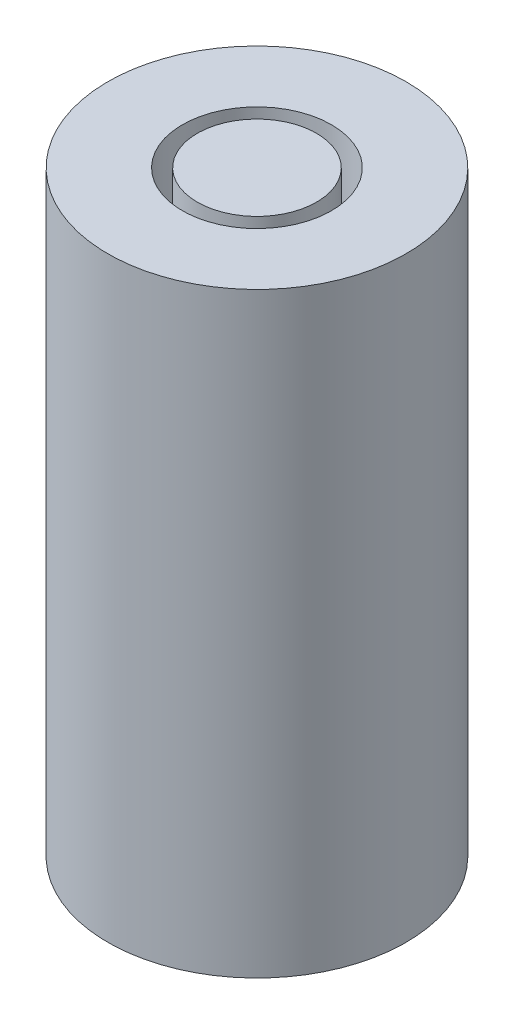
ISO-10303-21;
HEADER;
FILE_DESCRIPTION(('STEP AP214'),'2;1');
FILE_NAME('part.step','',(''),(''),'','','');
FILE_SCHEMA(('AUTOMOTIVE_DESIGN { 1 0 10303 214 1 1 1 1 }'));
ENDSEC;
DATA;
#1=APPLICATION_CONTEXT('core data for automotive mechanical design processes');
#2=APPLICATION_PROTOCOL_DEFINITION('international standard','automotive_design',2000,#1);
#3=PRODUCT_CONTEXT('',#1,'mechanical');
#4=PRODUCT('Part','Part','',(#3));
#5=PRODUCT_RELATED_PRODUCT_CATEGORY('part','',(#4));
#6=PRODUCT_DEFINITION_FORMATION('','',#4);
#7=PRODUCT_DEFINITION_CONTEXT('part definition',#1,'design');
#8=PRODUCT_DEFINITION('design','',#6,#7);
#9=PRODUCT_DEFINITION_SHAPE('','',#8);
#10=(LENGTH_UNIT() NAMED_UNIT(*) SI_UNIT(.MILLI.,.METRE.));
#11=(NAMED_UNIT(*) PLANE_ANGLE_UNIT() SI_UNIT($,.RADIAN.));
#12=(NAMED_UNIT(*) SI_UNIT($,.STERADIAN.) SOLID_ANGLE_UNIT());
#13=UNCERTAINTY_MEASURE_WITH_UNIT(LENGTH_MEASURE(1.E-05),#10,'distance_accuracy_value','');
#14=(GEOMETRIC_REPRESENTATION_CONTEXT(3) GLOBAL_UNCERTAINTY_ASSIGNED_CONTEXT((#13)) GLOBAL_UNIT_ASSIGNED_CONTEXT((#10,
#11,#12)) REPRESENTATION_CONTEXT('',''));
#15=CARTESIAN_POINT('',(0.,0.,0.));
#16=DIRECTION('',(0.,0.,1.));
#17=DIRECTION('',(1.,0.,0.));
#18=AXIS2_PLACEMENT_3D('',#15,#16,#17);
#19=CARTESIAN_POINT('',(0.,10.,0.));
#20=DIRECTION('',(0.,-1.,0.));
#21=DIRECTION('',(0.,0.,-1.));
#22=AXIS2_PLACEMENT_3D('',#19,#20,#21);
#23=CYLINDRICAL_SURFACE('',#22,2.5);
#24=CARTESIAN_POINT('',(0.,10.,0.));
#25=DIRECTION('',(0.,-1.,0.));
#26=DIRECTION('',(0.,0.,-1.));
#27=AXIS2_PLACEMENT_3D('',#24,#25,#26);
#28=CIRCLE('',#27,2.5);
#29=CARTESIAN_POINT('',(0.,10.,-2.5));
#30=VERTEX_POINT('',#29);
#31=EDGE_CURVE('E11',#30,#30,#28,.T.);
#32=ORIENTED_EDGE('',*,*,#31,.T.);
#33=EDGE_LOOP('',(#32));
#34=FACE_BOUND('',#33,.T.);
#35=CARTESIAN_POINT('',(0.,0.,0.));
#36=DIRECTION('',(0.,-1.,0.));
#37=DIRECTION('',(0.,0.,-1.));
#38=AXIS2_PLACEMENT_3D('',#35,#36,#37);
#39=CIRCLE('',#38,2.5);
#40=CARTESIAN_POINT('',(0.,0.,-2.5));
#41=VERTEX_POINT('',#40);
#42=EDGE_CURVE('E46',#41,#41,#39,.T.);
#43=ORIENTED_EDGE('',*,*,#42,.F.);
#44=EDGE_LOOP('',(#43));
#45=FACE_BOUND('',#44,.T.);
#46=ADVANCED_FACE('F43',(#34,#45),#23,.T.);
#47=CARTESIAN_POINT('',(0.,10.,0.));
#48=DIRECTION('',(0.,-1.,0.));
#49=DIRECTION('',(0.,0.,-1.));
#50=AXIS2_PLACEMENT_3D('',#47,#48,#49);
#51=PLANE('',#50);
#52=CARTESIAN_POINT('',(0.,10.,0.));
#53=DIRECTION('',(0.,-1.,0.));
#54=DIRECTION('',(0.,0.,-1.));
#55=AXIS2_PLACEMENT_3D('',#52,#53,#54);
#56=CIRCLE('',#55,1.25);
#57=CARTESIAN_POINT('',(0.,10.,-1.25));
#58=VERTEX_POINT('',#57);
#59=EDGE_CURVE('E53',#58,#58,#56,.T.);
#60=ORIENTED_EDGE('',*,*,#59,.T.);
#61=EDGE_LOOP('',(#60));
#62=FACE_BOUND('',#61,.T.);
#63=ORIENTED_EDGE('',*,*,#31,.F.);
#64=EDGE_LOOP('',(#63));
#65=FACE_BOUND('',#64,.T.);
#66=ADVANCED_FACE('F61',(#62,#65),#51,.F.);
#67=CARTESIAN_POINT('',(0.,0.,0.));
#68=DIRECTION('',(0.,-1.,0.));
#69=DIRECTION('',(0.,0.,-1.));
#70=AXIS2_PLACEMENT_3D('',#67,#68,#69);
#71=PLANE('',#70);
#72=CARTESIAN_POINT('',(0.,0.,0.));
#73=DIRECTION('',(0.,-1.,0.));
#74=DIRECTION('',(0.,0.,-1.));
#75=AXIS2_PLACEMENT_3D('',#72,#73,#74);
#76=CIRCLE('',#75,1.25);
#77=CARTESIAN_POINT('',(0.,0.,-1.25));
#78=VERTEX_POINT('',#77);
#79=EDGE_CURVE('E55',#78,#78,#76,.T.);
#80=ORIENTED_EDGE('',*,*,#79,.F.);
#81=EDGE_LOOP('',(#80));
#82=FACE_BOUND('',#81,.T.);
#83=ORIENTED_EDGE('',*,*,#42,.T.);
#84=EDGE_LOOP('',(#83));
#85=FACE_BOUND('',#84,.T.);
#86=ADVANCED_FACE('F67',(#82,#85),#71,.T.);
#87=CARTESIAN_POINT('',(0.,10.,0.));
#88=DIRECTION('',(0.,-1.,0.));
#89=DIRECTION('',(0.,0.,-1.));
#90=AXIS2_PLACEMENT_3D('',#87,#88,#89);
#91=CYLINDRICAL_SURFACE('',#90,1.25);
#92=ORIENTED_EDGE('',*,*,#59,.F.);
#93=EDGE_LOOP('',(#92));
#94=FACE_BOUND('',#93,.T.);
#95=ORIENTED_EDGE('',*,*,#79,.T.);
#96=EDGE_LOOP('',(#95));
#97=FACE_BOUND('',#96,.T.);
#98=ADVANCED_FACE('F64',(#94,#97),#91,.F.);
#99=CLOSED_SHELL('',(#46,#66,#86,#98));
#100=MANIFOLD_SOLID_BREP('B2',#99);
#101=CARTESIAN_POINT('',(0.,10.,0.));
#102=DIRECTION('',(0.,-1.,0.));
#103=DIRECTION('',(0.,0.,-1.));
#104=AXIS2_PLACEMENT_3D('',#101,#102,#103);
#105=CYLINDRICAL_SURFACE('',#104,1.);
#106=CARTESIAN_POINT('',(0.,10.,0.));
#107=DIRECTION('',(0.,1.,0.));
#108=DIRECTION('',(0.,0.,1.));
#109=AXIS2_PLACEMENT_3D('',#106,#107,#108);
#110=CIRCLE('',#109,1.);
#111=CARTESIAN_POINT('',(0.,10.,1.));
#112=VERTEX_POINT('',#111);
#113=EDGE_CURVE('E42',#112,#112,#110,.T.);
#114=ORIENTED_EDGE('',*,*,#113,.F.);
#115=EDGE_LOOP('',(#114));
#116=FACE_BOUND('',#115,.T.);
#117=CARTESIAN_POINT('',(0.,0.,0.));
#118=DIRECTION('',(0.,1.,0.));
#119=DIRECTION('',(0.,0.,1.));
#120=AXIS2_PLACEMENT_3D('',#117,#118,#119);
#121=CIRCLE('',#120,1.);
#122=CARTESIAN_POINT('',(0.,0.,1.));
#123=VERTEX_POINT('',#122);
#124=EDGE_CURVE('E116',#123,#123,#121,.T.);
#125=ORIENTED_EDGE('',*,*,#124,.T.);
#126=EDGE_LOOP('',(#125));
#127=FACE_BOUND('',#126,.T.);
#128=ADVANCED_FACE('F113',(#116,#127),#105,.T.);
#129=CARTESIAN_POINT('',(0.,10.,0.));
#130=DIRECTION('',(0.,1.,0.));
#131=DIRECTION('',(0.,0.,1.));
#132=AXIS2_PLACEMENT_3D('',#129,#130,#131);
#133=PLANE('',#132);
#134=ORIENTED_EDGE('',*,*,#113,.T.);
#135=EDGE_LOOP('',(#134));
#136=FACE_BOUND('',#135,.T.);
#137=ADVANCED_FACE('F128',(#136),#133,.T.);
#138=CARTESIAN_POINT('',(0.,0.,0.));
#139=DIRECTION('',(0.,1.,0.));
#140=DIRECTION('',(0.,0.,1.));
#141=AXIS2_PLACEMENT_3D('',#138,#139,#140);
#142=PLANE('',#141);
#143=ORIENTED_EDGE('',*,*,#124,.F.);
#144=EDGE_LOOP('',(#143));
#145=FACE_BOUND('',#144,.T.);
#146=ADVANCED_FACE('F126',(#145),#142,.F.);
#147=CLOSED_SHELL('',(#128,#137,#146));
#148=MANIFOLD_SOLID_BREP('B6',#147);
#149=ADVANCED_BREP_SHAPE_REPRESENTATION('',(#18,#100,#148),#14);
#150=SHAPE_DEFINITION_REPRESENTATION(#9,#149);
ENDSEC;
END-ISO-10303-21;
